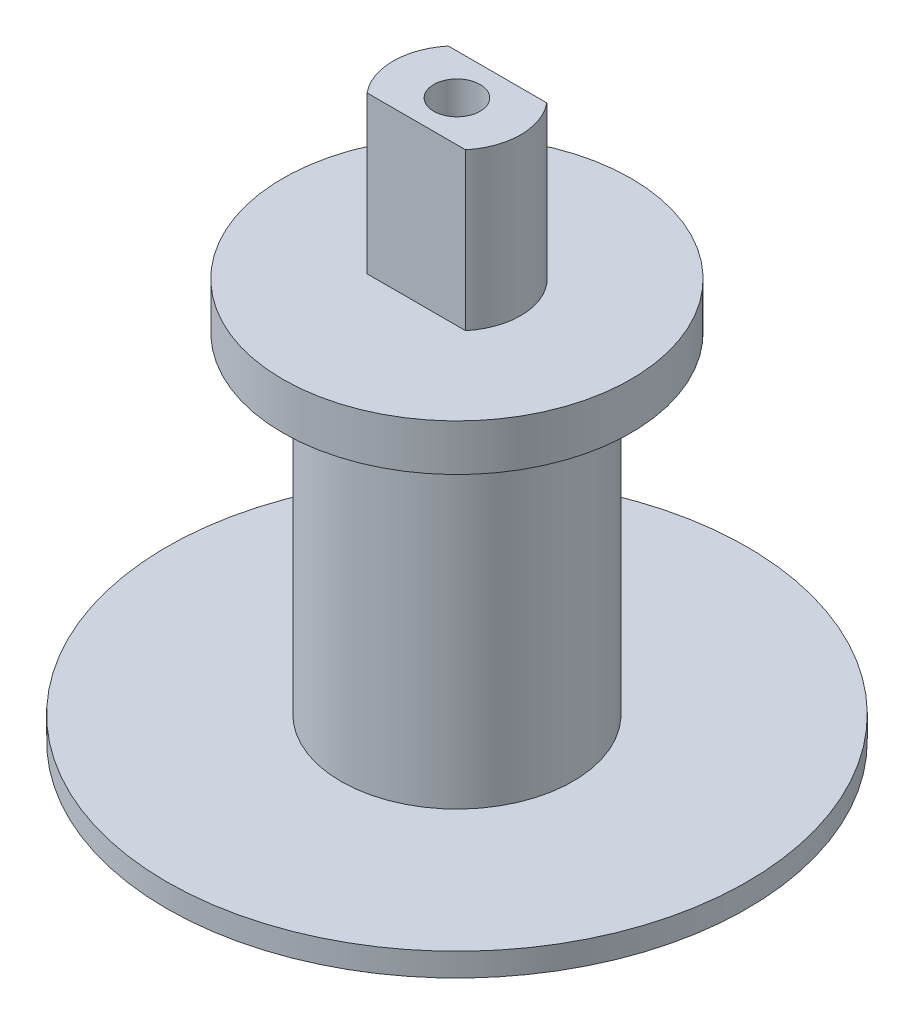
ISO-10303-21;
HEADER;
FILE_DESCRIPTION(('STEP AP214'),'2;1');
FILE_NAME('part.step','',(''),(''),'','','');
FILE_SCHEMA(('AUTOMOTIVE_DESIGN { 1 0 10303 214 1 1 1 1 }'));
ENDSEC;
DATA;
#1=APPLICATION_CONTEXT('core data for automotive mechanical design processes');
#2=APPLICATION_PROTOCOL_DEFINITION('international standard','automotive_design',2000,#1);
#3=PRODUCT_CONTEXT('',#1,'mechanical');
#4=PRODUCT('Part','Part','',(#3));
#5=PRODUCT_RELATED_PRODUCT_CATEGORY('part','',(#4));
#6=PRODUCT_DEFINITION_FORMATION('','',#4);
#7=PRODUCT_DEFINITION_CONTEXT('part definition',#1,'design');
#8=PRODUCT_DEFINITION('design','',#6,#7);
#9=PRODUCT_DEFINITION_SHAPE('','',#8);
#10=(LENGTH_UNIT() NAMED_UNIT(*) SI_UNIT(.MILLI.,.METRE.));
#11=(NAMED_UNIT(*) PLANE_ANGLE_UNIT() SI_UNIT($,.RADIAN.));
#12=(NAMED_UNIT(*) SI_UNIT($,.STERADIAN.) SOLID_ANGLE_UNIT());
#13=UNCERTAINTY_MEASURE_WITH_UNIT(LENGTH_MEASURE(1.E-05),#10,'distance_accuracy_value','');
#14=(GEOMETRIC_REPRESENTATION_CONTEXT(3) GLOBAL_UNCERTAINTY_ASSIGNED_CONTEXT((#13)) GLOBAL_UNIT_ASSIGNED_CONTEXT((#10,
#11,#12)) REPRESENTATION_CONTEXT('',''));
#15=CARTESIAN_POINT('',(0.,0.,0.));
#16=DIRECTION('',(0.,0.,1.));
#17=DIRECTION('',(1.,0.,0.));
#18=AXIS2_PLACEMENT_3D('',#15,#16,#17);
#19=CARTESIAN_POINT('',(0.,-6.,0.));
#20=DIRECTION('',(0.,1.,0.));
#21=DIRECTION('',(0.,0.,1.));
#22=AXIS2_PLACEMENT_3D('',#19,#20,#21);
#23=CYLINDRICAL_SURFACE('',#22,1.);
#24=CARTESIAN_POINT('',(0.,17.,0.));
#25=DIRECTION('',(0.,1.,0.));
#26=DIRECTION('',(0.,0.,1.));
#27=AXIS2_PLACEMENT_3D('',#24,#25,#26);
#28=CIRCLE('',#27,1.);
#29=CARTESIAN_POINT('',(0.,17.,1.));
#30=VERTEX_POINT('',#29);
#31=EDGE_CURVE('E109',#30,#30,#28,.F.);
#32=ORIENTED_EDGE('',*,*,#31,.T.);
#33=EDGE_LOOP('',(#32));
#34=FACE_BOUND('',#33,.T.);
#35=CARTESIAN_POINT('',(0.,24.,0.));
#36=DIRECTION('',(0.,-1.,0.));
#37=DIRECTION('',(0.,0.,-1.));
#38=AXIS2_PLACEMENT_3D('',#35,#36,#37);
#39=CIRCLE('',#38,1.);
#40=CARTESIAN_POINT('',(0.,24.,-1.));
#41=VERTEX_POINT('',#40);
#42=EDGE_CURVE('E112',#41,#41,#39,.T.);
#43=ORIENTED_EDGE('',*,*,#42,.F.);
#44=EDGE_LOOP('',(#43));
#45=FACE_BOUND('',#44,.T.);
#46=ADVANCED_FACE('F43',(#34,#45),#23,.F.);
#47=CARTESIAN_POINT('',(0.,24.,0.));
#48=DIRECTION('',(0.,-1.,0.));
#49=DIRECTION('',(0.,0.,-1.));
#50=AXIS2_PLACEMENT_3D('',#47,#48,#49);
#51=CYLINDRICAL_SURFACE('',#50,2.75000000000005);
#52=DIRECTION('',(0.,-1.,0.));
#53=VECTOR('',#52,1.);
#54=CARTESIAN_POINT('',(-2.12132034355971,24.,-1.75));
#55=LINE('',#54,#53);
#56=CARTESIAN_POINT('',(-2.12132034355971,24.,-1.75));
#57=VERTEX_POINT('',#56);
#58=CARTESIAN_POINT('',(-2.12132034355971,17.25,-1.75));
#59=VERTEX_POINT('',#58);
#60=EDGE_CURVE('E47',#57,#59,#55,.T.);
#61=ORIENTED_EDGE('',*,*,#60,.T.);
#62=CARTESIAN_POINT('',(0.,17.25,0.));
#63=DIRECTION('',(0.,1.,0.));
#64=DIRECTION('',(0.,0.,1.));
#65=AXIS2_PLACEMENT_3D('',#62,#63,#64);
#66=CIRCLE('',#65,2.75000000000005);
#67=CARTESIAN_POINT('',(-2.12132034355971,17.25,1.75));
#68=VERTEX_POINT('',#67);
#69=EDGE_CURVE('E89',#68,#59,#66,.F.);
#70=ORIENTED_EDGE('',*,*,#69,.F.);
#71=DIRECTION('',(0.,-1.,0.));
#72=VECTOR('',#71,1.);
#73=CARTESIAN_POINT('',(-2.12132034355971,24.,1.75));
#74=LINE('',#73,#72);
#75=CARTESIAN_POINT('',(-2.12132034355971,24.,1.75));
#76=VERTEX_POINT('',#75);
#77=EDGE_CURVE('E12',#76,#68,#74,.T.);
#78=ORIENTED_EDGE('',*,*,#77,.F.);
#79=CARTESIAN_POINT('',(0.,24.,0.));
#80=DIRECTION('',(0.,-1.,0.));
#81=DIRECTION('',(0.,0.,-1.));
#82=AXIS2_PLACEMENT_3D('',#79,#80,#81);
#83=CIRCLE('',#82,2.75000000000005);
#84=EDGE_CURVE('E115',#76,#57,#83,.T.);
#85=ORIENTED_EDGE('',*,*,#84,.T.);
#86=EDGE_LOOP('',(#61,#70,#78,#85));
#87=FACE_BOUND('',#86,.T.);
#88=ADVANCED_FACE('F90',(#87),#51,.T.);
#89=CARTESIAN_POINT('',(2.12132034355971,24.,1.75));
#90=DIRECTION('',(0.,0.,1.));
#91=DIRECTION('',(1.,0.,0.));
#92=AXIS2_PLACEMENT_3D('',#89,#90,#91);
#93=PLANE('',#92);
#94=ORIENTED_EDGE('',*,*,#77,.T.);
#95=DIRECTION('',(-1.,0.,0.));
#96=VECTOR('',#95,1.);
#97=CARTESIAN_POINT('',(0.,17.25,1.75));
#98=LINE('',#97,#96);
#99=CARTESIAN_POINT('',(2.12132034355971,17.25,1.75));
#100=VERTEX_POINT('',#99);
#101=EDGE_CURVE('E84',#100,#68,#98,.T.);
#102=ORIENTED_EDGE('',*,*,#101,.F.);
#103=DIRECTION('',(0.,-1.,0.));
#104=VECTOR('',#103,1.);
#105=CARTESIAN_POINT('',(2.12132034355971,24.,1.75));
#106=LINE('',#105,#104);
#107=CARTESIAN_POINT('',(2.12132034355971,24.,1.75));
#108=VERTEX_POINT('',#107);
#109=EDGE_CURVE('E52',#108,#100,#106,.T.);
#110=ORIENTED_EDGE('',*,*,#109,.F.);
#111=DIRECTION('',(-1.,0.,0.));
#112=VECTOR('',#111,1.);
#113=CARTESIAN_POINT('',(2.12132034355971,24.,1.75));
#114=LINE('',#113,#112);
#115=EDGE_CURVE('E87',#108,#76,#114,.T.);
#116=ORIENTED_EDGE('',*,*,#115,.T.);
#117=EDGE_LOOP('',(#94,#102,#110,#116));
#118=FACE_BOUND('',#117,.T.);
#119=ADVANCED_FACE('F82',(#118),#93,.T.);
#120=CARTESIAN_POINT('',(0.,24.,0.));
#121=DIRECTION('',(0.,-1.,0.));
#122=DIRECTION('',(0.,0.,-1.));
#123=AXIS2_PLACEMENT_3D('',#120,#121,#122);
#124=CYLINDRICAL_SURFACE('',#123,2.75000000000005);
#125=ORIENTED_EDGE('',*,*,#109,.T.);
#126=CARTESIAN_POINT('',(0.,17.25,0.));
#127=DIRECTION('',(0.,1.,0.));
#128=DIRECTION('',(0.,0.,1.));
#129=AXIS2_PLACEMENT_3D('',#126,#127,#128);
#130=CIRCLE('',#129,2.75000000000005);
#131=CARTESIAN_POINT('',(2.12132034355971,17.25,-1.75));
#132=VERTEX_POINT('',#131);
#133=EDGE_CURVE('E98',#132,#100,#130,.F.);
#134=ORIENTED_EDGE('',*,*,#133,.F.);
#135=DIRECTION('',(0.,-1.,0.));
#136=VECTOR('',#135,1.);
#137=CARTESIAN_POINT('',(2.12132034355971,24.,-1.75));
#138=LINE('',#137,#136);
#139=CARTESIAN_POINT('',(2.12132034355971,24.,-1.75));
#140=VERTEX_POINT('',#139);
#141=EDGE_CURVE('E123',#140,#132,#138,.T.);
#142=ORIENTED_EDGE('',*,*,#141,.F.);
#143=CARTESIAN_POINT('',(0.,24.,0.));
#144=DIRECTION('',(0.,-1.,0.));
#145=DIRECTION('',(0.,0.,-1.));
#146=AXIS2_PLACEMENT_3D('',#143,#144,#145);
#147=CIRCLE('',#146,2.75000000000005);
#148=EDGE_CURVE('E120',#140,#108,#147,.T.);
#149=ORIENTED_EDGE('',*,*,#148,.T.);
#150=EDGE_LOOP('',(#125,#134,#142,#149));
#151=FACE_BOUND('',#150,.T.);
#152=ADVANCED_FACE('F129',(#151),#124,.T.);
#153=CARTESIAN_POINT('',(-2.12132034355971,24.,-1.75));
#154=DIRECTION('',(0.,0.,-1.));
#155=DIRECTION('',(-1.,0.,0.));
#156=AXIS2_PLACEMENT_3D('',#153,#154,#155);
#157=PLANE('',#156);
#158=ORIENTED_EDGE('',*,*,#141,.T.);
#159=DIRECTION('',(1.,0.,0.));
#160=VECTOR('',#159,1.);
#161=CARTESIAN_POINT('',(0.,17.25,-1.75));
#162=LINE('',#161,#160);
#163=EDGE_CURVE('E94',#59,#132,#162,.T.);
#164=ORIENTED_EDGE('',*,*,#163,.F.);
#165=ORIENTED_EDGE('',*,*,#60,.F.);
#166=DIRECTION('',(1.,0.,0.));
#167=VECTOR('',#166,1.);
#168=CARTESIAN_POINT('',(-2.12132034355971,24.,-1.75));
#169=LINE('',#168,#167);
#170=EDGE_CURVE('E117',#57,#140,#169,.T.);
#171=ORIENTED_EDGE('',*,*,#170,.T.);
#172=EDGE_LOOP('',(#158,#164,#165,#171));
#173=FACE_BOUND('',#172,.T.);
#174=ADVANCED_FACE('F125',(#173),#157,.T.);
#175=CARTESIAN_POINT('',(0.,24.,0.));
#176=DIRECTION('',(0.,-1.,0.));
#177=DIRECTION('',(0.,0.,-1.));
#178=AXIS2_PLACEMENT_3D('',#175,#176,#177);
#179=PLANE('',#178);
#180=ORIENTED_EDGE('',*,*,#42,.T.);
#181=EDGE_LOOP('',(#180));
#182=FACE_BOUND('',#181,.T.);
#183=ORIENTED_EDGE('',*,*,#84,.F.);
#184=ORIENTED_EDGE('',*,*,#115,.F.);
#185=ORIENTED_EDGE('',*,*,#148,.F.);
#186=ORIENTED_EDGE('',*,*,#170,.F.);
#187=EDGE_LOOP('',(#183,#184,#185,#186));
#188=FACE_BOUND('',#187,.T.);
#189=ADVANCED_FACE('F131',(#182,#188),#179,.F.);
#190=CARTESIAN_POINT('',(0.,17.,0.));
#191=DIRECTION('',(0.,-1.,0.));
#192=DIRECTION('',(0.,0.,-1.));
#193=AXIS2_PLACEMENT_3D('',#190,#191,#192);
#194=PLANE('',#193);
#195=ORIENTED_EDGE('',*,*,#31,.F.);
#196=EDGE_LOOP('',(#195));
#197=FACE_BOUND('',#196,.T.);
#198=ADVANCED_FACE('F133',(#197),#194,.F.);
#199=CARTESIAN_POINT('',(0.,17.25,0.));
#200=DIRECTION('',(0.,1.,0.));
#201=DIRECTION('',(0.,0.,1.));
#202=AXIS2_PLACEMENT_3D('',#199,#200,#201);
#203=PLANE('',#202);
#204=CARTESIAN_POINT('',(0.,17.25,0.));
#205=DIRECTION('',(0.,1.,0.));
#206=DIRECTION('',(0.,0.,1.));
#207=AXIS2_PLACEMENT_3D('',#204,#205,#206);
#208=CIRCLE('',#207,7.5);
#209=CARTESIAN_POINT('',(0.,17.25,7.5));
#210=VERTEX_POINT('',#209);
#211=EDGE_CURVE('E99',#210,#210,#208,.T.);
#212=ORIENTED_EDGE('',*,*,#211,.T.);
#213=EDGE_LOOP('',(#212));
#214=FACE_BOUND('',#213,.T.);
#215=ORIENTED_EDGE('',*,*,#101,.T.);
#216=ORIENTED_EDGE('',*,*,#69,.T.);
#217=ORIENTED_EDGE('',*,*,#163,.T.);
#218=ORIENTED_EDGE('',*,*,#133,.T.);
#219=EDGE_LOOP('',(#215,#216,#217,#218));
#220=FACE_BOUND('',#219,.T.);
#221=ADVANCED_FACE('F96',(#214,#220),#203,.T.);
#222=CARTESIAN_POINT('',(0.,15.25,0.));
#223=DIRECTION('',(0.,-1.,0.));
#224=DIRECTION('',(0.,0.,-1.));
#225=AXIS2_PLACEMENT_3D('',#222,#223,#224);
#226=PLANE('',#225);
#227=CARTESIAN_POINT('',(0.,15.25,0.));
#228=DIRECTION('',(0.,-1.,0.));
#229=DIRECTION('',(0.,0.,-1.));
#230=AXIS2_PLACEMENT_3D('',#227,#228,#229);
#231=CIRCLE('',#230,7.5);
#232=CARTESIAN_POINT('',(0.,15.25,-7.5));
#233=VERTEX_POINT('',#232);
#234=EDGE_CURVE('E106',#233,#233,#231,.T.);
#235=ORIENTED_EDGE('',*,*,#234,.T.);
#236=EDGE_LOOP('',(#235));
#237=FACE_BOUND('',#236,.T.);
#238=ADVANCED_FACE('F177',(#237),#226,.T.);
#239=CARTESIAN_POINT('',(0.,19.,0.));
#240=DIRECTION('',(0.,-1.,0.));
#241=DIRECTION('',(0.,0.,-1.));
#242=AXIS2_PLACEMENT_3D('',#239,#240,#241);
#243=CYLINDRICAL_SURFACE('',#242,7.5);
#244=ORIENTED_EDGE('',*,*,#234,.F.);
#245=EDGE_LOOP('',(#244));
#246=FACE_BOUND('',#245,.T.);
#247=ORIENTED_EDGE('',*,*,#211,.F.);
#248=EDGE_LOOP('',(#247));
#249=FACE_BOUND('',#248,.T.);
#250=ADVANCED_FACE('F45',(#246,#249),#243,.T.);
#251=CLOSED_SHELL('',(#46,#88,#119,#152,#174,#189,#198,#221,#238,#250));
#252=MANIFOLD_SOLID_BREP('B2',#251);
#253=CARTESIAN_POINT('',(0.,1.,0.));
#254=DIRECTION('',(0.,1.,0.));
#255=DIRECTION('',(0.,0.,1.));
#256=AXIS2_PLACEMENT_3D('',#253,#254,#255);
#257=PLANE('',#256);
#258=CARTESIAN_POINT('',(0.,1.,0.));
#259=DIRECTION('',(0.,1.,0.));
#260=DIRECTION('',(0.,0.,1.));
#261=AXIS2_PLACEMENT_3D('',#258,#259,#260);
#262=CIRCLE('',#261,5.);
#263=CARTESIAN_POINT('',(0.,1.,5.));
#264=VERTEX_POINT('',#263);
#265=EDGE_CURVE('E318',#264,#264,#262,.T.);
#266=ORIENTED_EDGE('',*,*,#265,.F.);
#267=EDGE_LOOP('',(#266));
#268=FACE_BOUND('',#267,.T.);
#269=CARTESIAN_POINT('',(0.,1.,0.));
#270=DIRECTION('',(0.,1.,0.));
#271=DIRECTION('',(0.,0.,1.));
#272=AXIS2_PLACEMENT_3D('',#269,#270,#271);
#273=CIRCLE('',#272,12.5);
#274=CARTESIAN_POINT('',(0.,1.,12.5));
#275=VERTEX_POINT('',#274);
#276=EDGE_CURVE('E344',#275,#275,#273,.T.);
#277=ORIENTED_EDGE('',*,*,#276,.T.);
#278=EDGE_LOOP('',(#277));
#279=FACE_BOUND('',#278,.T.);
#280=ADVANCED_FACE('F263',(#268,#279),#257,.T.);
#281=CARTESIAN_POINT('',(0.,15.,0.));
#282=DIRECTION('',(0.,-1.,0.));
#283=DIRECTION('',(0.,0.,-1.));
#284=AXIS2_PLACEMENT_3D('',#281,#282,#283);
#285=CYLINDRICAL_SURFACE('',#284,5.);
#286=CARTESIAN_POINT('',(0.,15.,0.));
#287=DIRECTION('',(0.,1.,0.));
#288=DIRECTION('',(0.,0.,1.));
#289=AXIS2_PLACEMENT_3D('',#286,#287,#288);
#290=CIRCLE('',#289,5.);
#291=CARTESIAN_POINT('',(0.,15.,5.));
#292=VERTEX_POINT('',#291);
#293=EDGE_CURVE('E309',#292,#292,#290,.T.);
#294=ORIENTED_EDGE('',*,*,#293,.F.);
#295=EDGE_LOOP('',(#294));
#296=FACE_BOUND('',#295,.T.);
#297=ORIENTED_EDGE('',*,*,#265,.T.);
#298=EDGE_LOOP('',(#297));
#299=FACE_BOUND('',#298,.T.);
#300=ADVANCED_FACE('F363',(#296,#299),#285,.T.);
#301=CARTESIAN_POINT('',(0.,15.,0.));
#302=DIRECTION('',(0.,1.,0.));
#303=DIRECTION('',(0.,0.,1.));
#304=AXIS2_PLACEMENT_3D('',#301,#302,#303);
#305=PLANE('',#304);
#306=DIRECTION('',(-1.,0.,0.));
#307=VECTOR('',#306,1.);
#308=CARTESIAN_POINT('',(0.,15.,-2.));
#309=LINE('',#308,#307);
#310=CARTESIAN_POINT('',(2.23606797749979,15.,-2.));
#311=VERTEX_POINT('',#310);
#312=CARTESIAN_POINT('',(-2.23606797749979,15.,-2.));
#313=VERTEX_POINT('',#312);
#314=EDGE_CURVE('E339',#311,#313,#309,.T.);
#315=ORIENTED_EDGE('',*,*,#314,.F.);
#316=CARTESIAN_POINT('',(0.,15.,0.));
#317=DIRECTION('',(0.,1.,0.));
#318=DIRECTION('',(0.,0.,1.));
#319=AXIS2_PLACEMENT_3D('',#316,#317,#318);
#320=CIRCLE('',#319,3.);
#321=CARTESIAN_POINT('',(2.23606797749979,15.,2.));
#322=VERTEX_POINT('',#321);
#323=EDGE_CURVE('E307',#322,#311,#320,.T.);
#324=ORIENTED_EDGE('',*,*,#323,.F.);
#325=DIRECTION('',(-1.,0.,0.));
#326=VECTOR('',#325,1.);
#327=CARTESIAN_POINT('',(0.,15.,2.));
#328=LINE('',#327,#326);
#329=CARTESIAN_POINT('',(-2.23606797749979,15.,2.));
#330=VERTEX_POINT('',#329);
#331=EDGE_CURVE('E334',#322,#330,#328,.T.);
#332=ORIENTED_EDGE('',*,*,#331,.T.);
#333=CARTESIAN_POINT('',(0.,15.,0.));
#334=DIRECTION('',(0.,1.,0.));
#335=DIRECTION('',(0.,0.,1.));
#336=AXIS2_PLACEMENT_3D('',#333,#334,#335);
#337=CIRCLE('',#336,3.);
#338=EDGE_CURVE('E337',#313,#330,#337,.T.);
#339=ORIENTED_EDGE('',*,*,#338,.F.);
#340=EDGE_LOOP('',(#315,#324,#332,#339));
#341=FACE_BOUND('',#340,.T.);
#342=ORIENTED_EDGE('',*,*,#293,.T.);
#343=EDGE_LOOP('',(#342));
#344=FACE_BOUND('',#343,.T.);
#345=ADVANCED_FACE('F368',(#341,#344),#305,.T.);
#346=CARTESIAN_POINT('',(0.,-4.,-2.));
#347=DIRECTION('',(0.,0.,-1.));
#348=DIRECTION('',(-1.,0.,0.));
#349=AXIS2_PLACEMENT_3D('',#346,#347,#348);
#350=PLANE('',#349);
#351=DIRECTION('',(0.,1.,0.));
#352=VECTOR('',#351,1.);
#353=CARTESIAN_POINT('',(-2.23606797749979,-4.,-2.));
#354=LINE('',#353,#352);
#355=CARTESIAN_POINT('',(-2.23606797749979,0.,-2.));
#356=VERTEX_POINT('',#355);
#357=EDGE_CURVE('E278',#356,#313,#354,.T.);
#358=ORIENTED_EDGE('',*,*,#357,.F.);
#359=DIRECTION('',(-1.,0.,0.));
#360=VECTOR('',#359,1.);
#361=CARTESIAN_POINT('',(0.,0.,-2.));
#362=LINE('',#361,#360);
#363=CARTESIAN_POINT('',(2.23606797749979,0.,-2.));
#364=VERTEX_POINT('',#363);
#365=EDGE_CURVE('E313',#364,#356,#362,.T.);
#366=ORIENTED_EDGE('',*,*,#365,.F.);
#367=DIRECTION('',(0.,1.,0.));
#368=VECTOR('',#367,1.);
#369=CARTESIAN_POINT('',(2.23606797749979,-4.,-2.));
#370=LINE('',#369,#368);
#371=EDGE_CURVE('E303',#364,#311,#370,.T.);
#372=ORIENTED_EDGE('',*,*,#371,.T.);
#373=ORIENTED_EDGE('',*,*,#314,.T.);
#374=EDGE_LOOP('',(#358,#366,#372,#373));
#375=FACE_BOUND('',#374,.T.);
#376=ADVANCED_FACE('F314',(#375),#350,.F.);
#377=CARTESIAN_POINT('',(0.,-4.,0.));
#378=DIRECTION('',(0.,1.,0.));
#379=DIRECTION('',(0.,0.,1.));
#380=AXIS2_PLACEMENT_3D('',#377,#378,#379);
#381=CYLINDRICAL_SURFACE('',#380,3.);
#382=ORIENTED_EDGE('',*,*,#371,.F.);
#383=CARTESIAN_POINT('',(0.,0.,0.));
#384=DIRECTION('',(0.,1.,0.));
#385=DIRECTION('',(0.,0.,1.));
#386=AXIS2_PLACEMENT_3D('',#383,#384,#385);
#387=CIRCLE('',#386,3.);
#388=CARTESIAN_POINT('',(2.23606797749979,0.,2.));
#389=VERTEX_POINT('',#388);
#390=EDGE_CURVE('E41',#389,#364,#387,.T.);
#391=ORIENTED_EDGE('',*,*,#390,.F.);
#392=DIRECTION('',(0.,1.,0.));
#393=VECTOR('',#392,1.);
#394=CARTESIAN_POINT('',(2.23606797749979,-4.,2.));
#395=LINE('',#394,#393);
#396=EDGE_CURVE('E310',#389,#322,#395,.T.);
#397=ORIENTED_EDGE('',*,*,#396,.T.);
#398=ORIENTED_EDGE('',*,*,#323,.T.);
#399=EDGE_LOOP('',(#382,#391,#397,#398));
#400=FACE_BOUND('',#399,.T.);
#401=ADVANCED_FACE('F304',(#400),#381,.F.);
#402=CARTESIAN_POINT('',(0.,-4.,2.));
#403=DIRECTION('',(0.,0.,-1.));
#404=DIRECTION('',(-1.,0.,0.));
#405=AXIS2_PLACEMENT_3D('',#402,#403,#404);
#406=PLANE('',#405);
#407=ORIENTED_EDGE('',*,*,#396,.F.);
#408=DIRECTION('',(1.,0.,0.));
#409=VECTOR('',#408,1.);
#410=CARTESIAN_POINT('',(0.,0.,2.));
#411=LINE('',#410,#409);
#412=CARTESIAN_POINT('',(-2.23606797749979,0.,2.));
#413=VERTEX_POINT('',#412);
#414=EDGE_CURVE('E271',#413,#389,#411,.T.);
#415=ORIENTED_EDGE('',*,*,#414,.F.);
#416=DIRECTION('',(0.,1.,0.));
#417=VECTOR('',#416,1.);
#418=CARTESIAN_POINT('',(-2.23606797749979,-4.,2.));
#419=LINE('',#418,#417);
#420=EDGE_CURVE('E330',#413,#330,#419,.T.);
#421=ORIENTED_EDGE('',*,*,#420,.T.);
#422=ORIENTED_EDGE('',*,*,#331,.F.);
#423=EDGE_LOOP('',(#407,#415,#421,#422));
#424=FACE_BOUND('',#423,.T.);
#425=ADVANCED_FACE('F358',(#424),#406,.T.);
#426=CARTESIAN_POINT('',(0.,-4.,0.));
#427=DIRECTION('',(0.,1.,0.));
#428=DIRECTION('',(0.,0.,1.));
#429=AXIS2_PLACEMENT_3D('',#426,#427,#428);
#430=CYLINDRICAL_SURFACE('',#429,3.);
#431=ORIENTED_EDGE('',*,*,#420,.F.);
#432=CARTESIAN_POINT('',(0.,0.,0.));
#433=DIRECTION('',(0.,1.,0.));
#434=DIRECTION('',(0.,0.,1.));
#435=AXIS2_PLACEMENT_3D('',#432,#433,#434);
#436=CIRCLE('',#435,3.);
#437=EDGE_CURVE('E317',#356,#413,#436,.T.);
#438=ORIENTED_EDGE('',*,*,#437,.F.);
#439=ORIENTED_EDGE('',*,*,#357,.T.);
#440=ORIENTED_EDGE('',*,*,#338,.T.);
#441=EDGE_LOOP('',(#431,#438,#439,#440));
#442=FACE_BOUND('',#441,.T.);
#443=ADVANCED_FACE('F351',(#442),#430,.F.);
#444=CARTESIAN_POINT('',(0.,-35.3553390593274,0.));
#445=DIRECTION('',(0.,1.,0.));
#446=DIRECTION('',(0.,0.,1.));
#447=AXIS2_PLACEMENT_3D('',#444,#445,#446);
#448=CYLINDRICAL_SURFACE('',#447,12.5);
#449=CARTESIAN_POINT('',(0.,0.,0.));
#450=DIRECTION('',(0.,1.,0.));
#451=DIRECTION('',(0.,0.,1.));
#452=AXIS2_PLACEMENT_3D('',#449,#450,#451);
#453=CIRCLE('',#452,12.5);
#454=CARTESIAN_POINT('',(0.,0.,12.5));
#455=VERTEX_POINT('',#454);
#456=EDGE_CURVE('E341',#455,#455,#453,.F.);
#457=ORIENTED_EDGE('',*,*,#456,.F.);
#458=EDGE_LOOP('',(#457));
#459=FACE_BOUND('',#458,.T.);
#460=ORIENTED_EDGE('',*,*,#276,.F.);
#461=EDGE_LOOP('',(#460));
#462=FACE_BOUND('',#461,.T.);
#463=ADVANCED_FACE('F349',(#459,#462),#448,.T.);
#464=CARTESIAN_POINT('',(0.,0.,0.));
#465=DIRECTION('',(0.,1.,0.));
#466=DIRECTION('',(0.,0.,1.));
#467=AXIS2_PLACEMENT_3D('',#464,#465,#466);
#468=PLANE('',#467);
#469=ORIENTED_EDGE('',*,*,#414,.T.);
#470=ORIENTED_EDGE('',*,*,#390,.T.);
#471=ORIENTED_EDGE('',*,*,#365,.T.);
#472=ORIENTED_EDGE('',*,*,#437,.T.);
#473=EDGE_LOOP('',(#469,#470,#471,#472));
#474=FACE_BOUND('',#473,.T.);
#475=ORIENTED_EDGE('',*,*,#456,.T.);
#476=EDGE_LOOP('',(#475));
#477=FACE_BOUND('',#476,.T.);
#478=ADVANCED_FACE('F265',(#474,#477),#468,.F.);
#479=CLOSED_SHELL('',(#280,#300,#345,#376,#401,#425,#443,#463,#478));
#480=MANIFOLD_SOLID_BREP('B6',#479);
#481=ADVANCED_BREP_SHAPE_REPRESENTATION('',(#18,#252,#480),#14);
#482=SHAPE_DEFINITION_REPRESENTATION(#9,#481);
ENDSEC;
END-ISO-10303-21;
